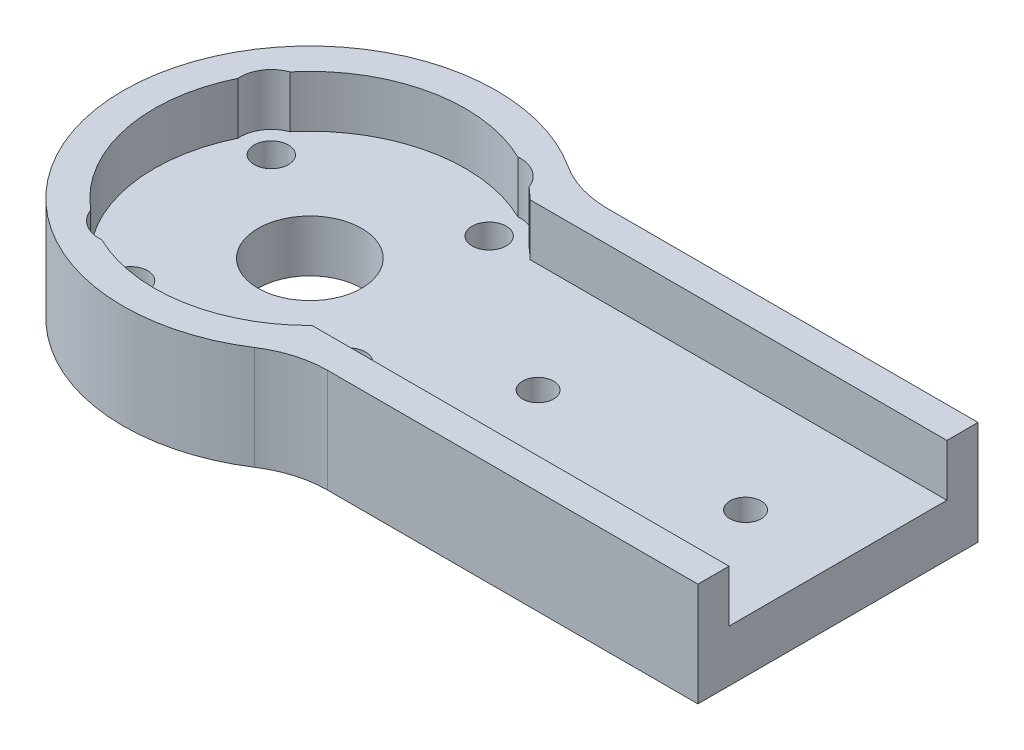
ISO-10303-21;
HEADER;
FILE_DESCRIPTION(('STEP AP214'),'2;1');
FILE_NAME('part.step','',(''),(''),'','','');
FILE_SCHEMA(('AUTOMOTIVE_DESIGN { 1 0 10303 214 1 1 1 1 }'));
ENDSEC;
DATA;
#1=APPLICATION_CONTEXT('core data for automotive mechanical design processes');
#2=APPLICATION_PROTOCOL_DEFINITION('international standard','automotive_design',2000,#1);
#3=PRODUCT_CONTEXT('',#1,'mechanical');
#4=PRODUCT('Part','Part','',(#3));
#5=PRODUCT_RELATED_PRODUCT_CATEGORY('part','',(#4));
#6=PRODUCT_DEFINITION_FORMATION('','',#4);
#7=PRODUCT_DEFINITION_CONTEXT('part definition',#1,'design');
#8=PRODUCT_DEFINITION('design','',#6,#7);
#9=PRODUCT_DEFINITION_SHAPE('','',#8);
#10=(LENGTH_UNIT() NAMED_UNIT(*) SI_UNIT(.MILLI.,.METRE.));
#11=(NAMED_UNIT(*) PLANE_ANGLE_UNIT() SI_UNIT($,.RADIAN.));
#12=(NAMED_UNIT(*) SI_UNIT($,.STERADIAN.) SOLID_ANGLE_UNIT());
#13=UNCERTAINTY_MEASURE_WITH_UNIT(LENGTH_MEASURE(1.E-05),#10,'distance_accuracy_value','');
#14=(GEOMETRIC_REPRESENTATION_CONTEXT(3) GLOBAL_UNCERTAINTY_ASSIGNED_CONTEXT((#13)) GLOBAL_UNIT_ASSIGNED_CONTEXT((#10,
#11,#12)) REPRESENTATION_CONTEXT('',''));
#15=CARTESIAN_POINT('',(0.,0.,0.));
#16=DIRECTION('',(0.,0.,1.));
#17=DIRECTION('',(1.,0.,0.));
#18=AXIS2_PLACEMENT_3D('',#15,#16,#17);
#19=CARTESIAN_POINT('',(0.,10.,0.));
#20=DIRECTION('',(0.,-1.,0.));
#21=DIRECTION('',(0.,0.,-1.));
#22=AXIS2_PLACEMENT_3D('',#19,#20,#21);
#23=CYLINDRICAL_SURFACE('',#22,15.);
#24=DIRECTION('',(0.,-1.,0.));
#25=VECTOR('',#24,1.);
#26=CARTESIAN_POINT('',(9.60224713630468,7.5,-11.5237515563869));
#27=LINE('',#26,#25);
#28=CARTESIAN_POINT('',(9.60224713630468,5.,-11.5237515563869));
#29=VERTEX_POINT('',#28);
#30=CARTESIAN_POINT('',(9.60224713630468,10.,-11.5237515563869));
#31=VERTEX_POINT('',#30);
#32=EDGE_CURVE('E195',#29,#31,#27,.F.);
#33=ORIENTED_EDGE('',*,*,#32,.F.);
#34=CARTESIAN_POINT('',(0.,5.,0.));
#35=DIRECTION('',(0.,-1.,0.));
#36=DIRECTION('',(0.,0.,1.));
#37=AXIS2_PLACEMENT_3D('',#34,#35,#36);
#38=CIRCLE('',#37,15.);
#39=CARTESIAN_POINT('',(10.7121426428143,5.,-10.5));
#40=VERTEX_POINT('',#39);
#41=EDGE_CURVE('E340',#29,#40,#38,.T.);
#42=ORIENTED_EDGE('',*,*,#41,.T.);
#43=DIRECTION('',(0.,-1.,0.));
#44=VECTOR('',#43,1.);
#45=CARTESIAN_POINT('',(10.7121426428143,10.,-10.5));
#46=LINE('',#45,#44);
#47=CARTESIAN_POINT('',(10.7121426428143,10.,-10.5));
#48=VERTEX_POINT('',#47);
#49=EDGE_CURVE('E239',#48,#40,#46,.T.);
#50=ORIENTED_EDGE('',*,*,#49,.F.);
#51=CARTESIAN_POINT('',(0.,10.,0.));
#52=DIRECTION('',(0.,-1.,0.));
#53=DIRECTION('',(0.,0.,1.));
#54=AXIS2_PLACEMENT_3D('',#51,#52,#53);
#55=CIRCLE('',#54,15.);
#56=EDGE_CURVE('E173',#31,#48,#55,.T.);
#57=ORIENTED_EDGE('',*,*,#56,.F.);
#58=EDGE_LOOP('',(#33,#42,#50,#57));
#59=FACE_BOUND('',#58,.T.);
#60=ADVANCED_FACE('F33',(#59),#23,.F.);
#61=DIRECTION('',(0.,-1.,0.));
#62=VECTOR('',#61,1.);
#63=CARTESIAN_POINT('',(6.55597581549295,7.5,-13.4914484436131));
#64=LINE('',#63,#62);
#65=CARTESIAN_POINT('',(6.55597581549295,10.,-13.4914484436131));
#66=VERTEX_POINT('',#65);
#67=CARTESIAN_POINT('',(6.55597581549295,5.,-13.4914484436131));
#68=VERTEX_POINT('',#67);
#69=EDGE_CURVE('E191',#66,#68,#64,.T.);
#70=ORIENTED_EDGE('',*,*,#69,.F.);
#71=CARTESIAN_POINT('',(-11.5237515563875,10.,-9.6022471363039));
#72=VERTEX_POINT('',#71);
#73=EDGE_CURVE('E174',#72,#66,#55,.T.);
#74=ORIENTED_EDGE('',*,*,#73,.F.);
#75=DIRECTION('',(0.,-1.,0.));
#76=VECTOR('',#75,1.);
#77=CARTESIAN_POINT('',(-11.5237515563875,7.5,-9.60224713630391));
#78=LINE('',#77,#76);
#79=CARTESIAN_POINT('',(-11.5237515563875,5.,-9.60224713630391));
#80=VERTEX_POINT('',#79);
#81=EDGE_CURVE('E189',#80,#72,#78,.F.);
#82=ORIENTED_EDGE('',*,*,#81,.F.);
#83=EDGE_CURVE('E192',#80,#68,#38,.T.);
#84=ORIENTED_EDGE('',*,*,#83,.T.);
#85=EDGE_LOOP('',(#70,#74,#82,#84));
#86=FACE_BOUND('',#85,.T.);
#87=ADVANCED_FACE('F187',(#86),#23,.F.);
#88=DIRECTION('',(0.,-1.,0.));
#89=VECTOR('',#88,1.);
#90=CARTESIAN_POINT('',(-9.60224713630402,7.5,11.5237515563874));
#91=LINE('',#90,#89);
#92=CARTESIAN_POINT('',(-9.60224713630402,5.,11.5237515563874));
#93=VERTEX_POINT('',#92);
#94=CARTESIAN_POINT('',(-9.60224713630403,10.,11.5237515563874));
#95=VERTEX_POINT('',#94);
#96=EDGE_CURVE('E150',#93,#95,#91,.F.);
#97=ORIENTED_EDGE('',*,*,#96,.F.);
#98=CARTESIAN_POINT('',(-13.4914484436131,5.,-6.55597581549307));
#99=VERTEX_POINT('',#98);
#100=EDGE_CURVE('E339',#93,#99,#38,.T.);
#101=ORIENTED_EDGE('',*,*,#100,.T.);
#102=DIRECTION('',(0.,-1.,0.));
#103=VECTOR('',#102,1.);
#104=CARTESIAN_POINT('',(-13.4914484436131,7.5,-6.55597581549309));
#105=LINE('',#104,#103);
#106=CARTESIAN_POINT('',(-13.4914484436131,10.,-6.55597581549309));
#107=VERTEX_POINT('',#106);
#108=EDGE_CURVE('E202',#107,#99,#105,.T.);
#109=ORIENTED_EDGE('',*,*,#108,.F.);
#110=EDGE_CURVE('E171',#95,#107,#55,.T.);
#111=ORIENTED_EDGE('',*,*,#110,.F.);
#112=EDGE_LOOP('',(#97,#101,#109,#111));
#113=FACE_BOUND('',#112,.T.);
#114=ADVANCED_FACE('F347',(#113),#23,.F.);
#115=DIRECTION('',(0.,-1.,0.));
#116=VECTOR('',#115,1.);
#117=CARTESIAN_POINT('',(-6.55597581549216,7.5,13.4914484436135));
#118=LINE('',#117,#116);
#119=CARTESIAN_POINT('',(-6.55597581549216,10.,13.4914484436135));
#120=VERTEX_POINT('',#119);
#121=CARTESIAN_POINT('',(-6.55597581549216,5.,13.4914484436135));
#122=VERTEX_POINT('',#121);
#123=EDGE_CURVE('E147',#120,#122,#118,.T.);
#124=ORIENTED_EDGE('',*,*,#123,.F.);
#125=CARTESIAN_POINT('',(10.7121426428143,10.,10.5));
#126=VERTEX_POINT('',#125);
#127=EDGE_CURVE('E161',#126,#120,#55,.T.);
#128=ORIENTED_EDGE('',*,*,#127,.F.);
#129=DIRECTION('',(0.,-1.,0.));
#130=VECTOR('',#129,1.);
#131=CARTESIAN_POINT('',(10.7121426428143,10.,10.5));
#132=LINE('',#131,#130);
#133=CARTESIAN_POINT('',(10.7121426428143,5.,10.5));
#134=VERTEX_POINT('',#133);
#135=EDGE_CURVE('E236',#126,#134,#132,.T.);
#136=ORIENTED_EDGE('',*,*,#135,.T.);
#137=EDGE_CURVE('E162',#134,#122,#38,.T.);
#138=ORIENTED_EDGE('',*,*,#137,.T.);
#139=EDGE_LOOP('',(#124,#128,#136,#138));
#140=FACE_BOUND('',#139,.T.);
#141=ADVANCED_FACE('F159',(#140),#23,.F.);
#142=CARTESIAN_POINT('',(50.9058808997907,5.,-13.5));
#143=DIRECTION('',(-1.,0.,0.));
#144=DIRECTION('',(0.,0.,1.));
#145=AXIS2_PLACEMENT_3D('',#142,#143,#144);
#146=PLANE('',#145);
#147=DIRECTION('',(0.,0.,-1.));
#148=VECTOR('',#147,1.);
#149=CARTESIAN_POINT('',(50.9058808997907,0.,-13.5));
#150=LINE('',#149,#148);
#151=CARTESIAN_POINT('',(50.9058808997907,0.,13.5));
#152=VERTEX_POINT('',#151);
#153=CARTESIAN_POINT('',(50.9058808997907,0.,-13.5));
#154=VERTEX_POINT('',#153);
#155=EDGE_CURVE('E284',#152,#154,#150,.T.);
#156=ORIENTED_EDGE('',*,*,#155,.T.);
#157=DIRECTION('',(0.,-1.,0.));
#158=VECTOR('',#157,1.);
#159=CARTESIAN_POINT('',(50.9058808997907,5.,-13.5));
#160=LINE('',#159,#158);
#161=CARTESIAN_POINT('',(50.9058808997907,10.,-13.5));
#162=VERTEX_POINT('',#161);
#163=EDGE_CURVE('E154',#162,#154,#160,.T.);
#164=ORIENTED_EDGE('',*,*,#163,.F.);
#165=DIRECTION('',(0.,0.,-1.));
#166=VECTOR('',#165,1.);
#167=CARTESIAN_POINT('',(50.9058808997907,10.,-13.5));
#168=LINE('',#167,#166);
#169=CARTESIAN_POINT('',(50.9058808997907,10.,-10.5));
#170=VERTEX_POINT('',#169);
#171=EDGE_CURVE('E209',#170,#162,#168,.T.);
#172=ORIENTED_EDGE('',*,*,#171,.F.);
#173=DIRECTION('',(0.,-1.,0.));
#174=VECTOR('',#173,1.);
#175=CARTESIAN_POINT('',(50.9058808997907,10.,-10.5));
#176=LINE('',#175,#174);
#177=CARTESIAN_POINT('',(50.9058808997907,5.,-10.5));
#178=VERTEX_POINT('',#177);
#179=EDGE_CURVE('E175',#170,#178,#176,.T.);
#180=ORIENTED_EDGE('',*,*,#179,.T.);
#181=DIRECTION('',(0.,0.,-1.));
#182=VECTOR('',#181,1.);
#183=CARTESIAN_POINT('',(50.9058808997907,5.,-13.5));
#184=LINE('',#183,#182);
#185=CARTESIAN_POINT('',(50.9058808997907,5.,10.5));
#186=VERTEX_POINT('',#185);
#187=EDGE_CURVE('E232',#186,#178,#184,.T.);
#188=ORIENTED_EDGE('',*,*,#187,.F.);
#189=DIRECTION('',(0.,-1.,0.));
#190=VECTOR('',#189,1.);
#191=CARTESIAN_POINT('',(50.9058808997907,10.,10.5));
#192=LINE('',#191,#190);
#193=CARTESIAN_POINT('',(50.9058808997907,10.,10.5));
#194=VERTEX_POINT('',#193);
#195=EDGE_CURVE('E228',#194,#186,#192,.T.);
#196=ORIENTED_EDGE('',*,*,#195,.F.);
#197=DIRECTION('',(0.,0.,-1.));
#198=VECTOR('',#197,1.);
#199=CARTESIAN_POINT('',(50.9058808997907,10.,13.5));
#200=LINE('',#199,#198);
#201=CARTESIAN_POINT('',(50.9058808997907,10.,13.5));
#202=VERTEX_POINT('',#201);
#203=EDGE_CURVE('E220',#202,#194,#200,.T.);
#204=ORIENTED_EDGE('',*,*,#203,.F.);
#205=DIRECTION('',(0.,-1.,0.));
#206=VECTOR('',#205,1.);
#207=CARTESIAN_POINT('',(50.9058808997907,5.,13.5));
#208=LINE('',#207,#206);
#209=EDGE_CURVE('E288',#202,#152,#208,.T.);
#210=ORIENTED_EDGE('',*,*,#209,.T.);
#211=EDGE_LOOP('',(#156,#164,#172,#180,#188,#196,#204,#210));
#212=FACE_BOUND('',#211,.T.);
#213=ADVANCED_FACE('F230',(#212),#146,.F.);
#214=CARTESIAN_POINT('',(11.9058808997907,5.,-13.5));
#215=DIRECTION('',(0.,0.,1.));
#216=DIRECTION('',(1.,0.,0.));
#217=AXIS2_PLACEMENT_3D('',#214,#215,#216);
#218=PLANE('',#217);
#219=DIRECTION('',(-1.,0.,0.));
#220=VECTOR('',#219,1.);
#221=CARTESIAN_POINT('',(11.9058808997907,0.,-13.5));
#222=LINE('',#221,#220);
#223=CARTESIAN_POINT('',(15.2233373476383,0.,-13.5));
#224=VERTEX_POINT('',#223);
#225=EDGE_CURVE('E291',#154,#224,#222,.T.);
#226=ORIENTED_EDGE('',*,*,#225,.T.);
#227=DIRECTION('',(0.,1.,0.));
#228=VECTOR('',#227,1.);
#229=CARTESIAN_POINT('',(15.2233373476383,10.,-13.5));
#230=LINE('',#229,#228);
#231=CARTESIAN_POINT('',(15.2233373476383,10.,-13.5));
#232=VERTEX_POINT('',#231);
#233=EDGE_CURVE('E305',#224,#232,#230,.T.);
#234=ORIENTED_EDGE('',*,*,#233,.T.);
#235=DIRECTION('',(-1.,0.,0.));
#236=VECTOR('',#235,1.);
#237=CARTESIAN_POINT('',(50.9058808997907,10.,-13.5));
#238=LINE('',#237,#236);
#239=EDGE_CURVE('E212',#162,#232,#238,.T.);
#240=ORIENTED_EDGE('',*,*,#239,.F.);
#241=ORIENTED_EDGE('',*,*,#163,.T.);
#242=EDGE_LOOP('',(#226,#234,#240,#241));
#243=FACE_BOUND('',#242,.T.);
#244=ADVANCED_FACE('F326',(#243),#218,.F.);
#245=CARTESIAN_POINT('',(0.,5.,0.));
#246=DIRECTION('',(0.,-1.,0.));
#247=DIRECTION('',(0.,0.,-1.));
#248=AXIS2_PLACEMENT_3D('',#245,#246,#247);
#249=CYLINDRICAL_SURFACE('',#248,18.);
#250=CARTESIAN_POINT('',(0.,10.,0.));
#251=DIRECTION('',(0.,1.,0.));
#252=DIRECTION('',(0.,0.,1.));
#253=AXIS2_PLACEMENT_3D('',#250,#251,#252);
#254=CIRCLE('',#253,18.);
#255=CARTESIAN_POINT('',(9.78643115205321,10.,-15.1071428571429));
#256=VERTEX_POINT('',#255);
#257=CARTESIAN_POINT('',(9.78643115205321,10.,15.1071428571429));
#258=VERTEX_POINT('',#257);
#259=EDGE_CURVE('E216',#256,#258,#254,.T.);
#260=ORIENTED_EDGE('',*,*,#259,.F.);
#261=DIRECTION('',(0.,-1.,0.));
#262=VECTOR('',#261,1.);
#263=CARTESIAN_POINT('',(9.78643115205321,5.,-15.1071428571429));
#264=LINE('',#263,#262);
#265=CARTESIAN_POINT('',(9.78643115205321,0.,-15.1071428571429));
#266=VERTEX_POINT('',#265);
#267=EDGE_CURVE('E302',#256,#266,#264,.T.);
#268=ORIENTED_EDGE('',*,*,#267,.T.);
#269=CARTESIAN_POINT('',(0.,0.,0.));
#270=DIRECTION('',(0.,1.,0.));
#271=DIRECTION('',(0.,0.,1.));
#272=AXIS2_PLACEMENT_3D('',#269,#270,#271);
#273=CIRCLE('',#272,18.);
#274=CARTESIAN_POINT('',(9.78643115205321,0.,15.1071428571429));
#275=VERTEX_POINT('',#274);
#276=EDGE_CURVE('E294',#266,#275,#273,.T.);
#277=ORIENTED_EDGE('',*,*,#276,.T.);
#278=DIRECTION('',(0.,-1.,0.));
#279=VECTOR('',#278,1.);
#280=CARTESIAN_POINT('',(9.78643115205321,5.,15.1071428571429));
#281=LINE('',#280,#279);
#282=EDGE_CURVE('E153',#275,#258,#281,.F.);
#283=ORIENTED_EDGE('',*,*,#282,.T.);
#284=EDGE_LOOP('',(#260,#268,#277,#283));
#285=FACE_BOUND('',#284,.T.);
#286=ADVANCED_FACE('F319',(#285),#249,.T.);
#287=CARTESIAN_POINT('',(11.9058808997907,5.,13.5));
#288=DIRECTION('',(0.,0.,-1.));
#289=DIRECTION('',(-1.,0.,0.));
#290=AXIS2_PLACEMENT_3D('',#287,#288,#289);
#291=PLANE('',#290);
#292=DIRECTION('',(1.,0.,0.));
#293=VECTOR('',#292,1.);
#294=CARTESIAN_POINT('',(50.9058808997907,10.,13.5));
#295=LINE('',#294,#293);
#296=CARTESIAN_POINT('',(15.2233373476383,10.,13.5));
#297=VERTEX_POINT('',#296);
#298=EDGE_CURVE('E218',#297,#202,#295,.T.);
#299=ORIENTED_EDGE('',*,*,#298,.F.);
#300=DIRECTION('',(0.,1.,0.));
#301=VECTOR('',#300,1.);
#302=CARTESIAN_POINT('',(15.2233373476383,0.,13.5));
#303=LINE('',#302,#301);
#304=CARTESIAN_POINT('',(15.2233373476383,0.,13.5));
#305=VERTEX_POINT('',#304);
#306=EDGE_CURVE('E307',#297,#305,#303,.F.);
#307=ORIENTED_EDGE('',*,*,#306,.T.);
#308=DIRECTION('',(1.,0.,0.));
#309=VECTOR('',#308,1.);
#310=CARTESIAN_POINT('',(11.9058808997907,0.,13.5));
#311=LINE('',#310,#309);
#312=EDGE_CURVE('E289',#305,#152,#311,.T.);
#313=ORIENTED_EDGE('',*,*,#312,.T.);
#314=ORIENTED_EDGE('',*,*,#209,.F.);
#315=EDGE_LOOP('',(#299,#307,#313,#314));
#316=FACE_BOUND('',#315,.T.);
#317=ADVANCED_FACE('F322',(#316),#291,.F.);
#318=CARTESIAN_POINT('',(0.,5.,0.));
#319=DIRECTION('',(0.,1.,0.));
#320=DIRECTION('',(0.,0.,1.));
#321=AXIS2_PLACEMENT_3D('',#318,#319,#320);
#322=PLANE('',#321);
#323=ORIENTED_EDGE('',*,*,#41,.F.);
#324=CARTESIAN_POINT('',(6.78232998312527,5.,-10.5));
#325=DIRECTION('',(0.,1.,0.));
#326=DIRECTION('',(0.,0.,1.));
#327=AXIS2_PLACEMENT_3D('',#324,#325,#326);
#328=CIRCLE('',#327,3.);
#329=EDGE_CURVE('E353',#29,#68,#328,.T.);
#330=ORIENTED_EDGE('',*,*,#329,.T.);
#331=ORIENTED_EDGE('',*,*,#83,.F.);
#332=CARTESIAN_POINT('',(-10.4999999999999,5.,-6.78232998312477));
#333=DIRECTION('',(0.,1.,0.));
#334=DIRECTION('',(0.,0.,1.));
#335=AXIS2_PLACEMENT_3D('',#332,#333,#334);
#336=CIRCLE('',#335,3.);
#337=EDGE_CURVE('E197',#80,#99,#336,.T.);
#338=ORIENTED_EDGE('',*,*,#337,.T.);
#339=ORIENTED_EDGE('',*,*,#100,.F.);
#340=CARTESIAN_POINT('',(-6.78232998312466,5.,10.5000000000004));
#341=DIRECTION('',(0.,1.,0.));
#342=DIRECTION('',(0.,0.,1.));
#343=AXIS2_PLACEMENT_3D('',#340,#341,#342);
#344=CIRCLE('',#343,3.);
#345=EDGE_CURVE('E354',#93,#122,#344,.T.);
#346=ORIENTED_EDGE('',*,*,#345,.T.);
#347=ORIENTED_EDGE('',*,*,#137,.F.);
#348=DIRECTION('',(-1.,0.,0.));
#349=VECTOR('',#348,1.);
#350=CARTESIAN_POINT('',(50.9058808997907,5.,10.5));
#351=LINE('',#350,#349);
#352=EDGE_CURVE('E208',#186,#134,#351,.T.);
#353=ORIENTED_EDGE('',*,*,#352,.F.);
#354=ORIENTED_EDGE('',*,*,#187,.T.);
#355=DIRECTION('',(1.,0.,0.));
#356=VECTOR('',#355,1.);
#357=CARTESIAN_POINT('',(50.9058808997907,5.,-10.5));
#358=LINE('',#357,#356);
#359=EDGE_CURVE('E213',#40,#178,#358,.T.);
#360=ORIENTED_EDGE('',*,*,#359,.F.);
#361=EDGE_LOOP('',(#323,#330,#331,#338,#339,#346,#347,#353,#354,#360));
#362=FACE_BOUND('',#361,.T.);
#363=CARTESIAN_POINT('',(42.,5.,0.));
#364=DIRECTION('',(0.,1.,0.));
#365=DIRECTION('',(0.,0.,1.));
#366=AXIS2_PLACEMENT_3D('',#363,#364,#365);
#367=CIRCLE('',#366,1.5);
#368=CARTESIAN_POINT('',(42.,5.,1.5));
#369=VERTEX_POINT('',#368);
#370=EDGE_CURVE('E235',#369,#369,#367,.T.);
#371=ORIENTED_EDGE('',*,*,#370,.F.);
#372=EDGE_LOOP('',(#371));
#373=FACE_BOUND('',#372,.T.);
#374=CARTESIAN_POINT('',(22.,5.,0.));
#375=DIRECTION('',(0.,1.,0.));
#376=DIRECTION('',(0.,0.,1.));
#377=AXIS2_PLACEMENT_3D('',#374,#375,#376);
#378=CIRCLE('',#377,1.5);
#379=CARTESIAN_POINT('',(22.,5.,1.5));
#380=VERTEX_POINT('',#379);
#381=EDGE_CURVE('E248',#380,#380,#378,.T.);
#382=ORIENTED_EDGE('',*,*,#381,.F.);
#383=EDGE_LOOP('',(#382));
#384=FACE_BOUND('',#383,.T.);
#385=CARTESIAN_POINT('',(10.5000000000005,5.,6.78232998312516));
#386=DIRECTION('',(0.,1.,0.));
#387=DIRECTION('',(0.,0.,1.));
#388=AXIS2_PLACEMENT_3D('',#385,#386,#387);
#389=CIRCLE('',#388,1.64999999999998);
#390=CARTESIAN_POINT('',(10.5000000000005,5.,8.43232998312515));
#391=VERTEX_POINT('',#390);
#392=EDGE_CURVE('E261',#391,#391,#389,.T.);
#393=ORIENTED_EDGE('',*,*,#392,.F.);
#394=EDGE_LOOP('',(#393));
#395=FACE_BOUND('',#394,.T.);
#396=CARTESIAN_POINT('',(0.,5.,0.));
#397=DIRECTION('',(0.,1.,0.));
#398=DIRECTION('',(0.,0.,1.));
#399=AXIS2_PLACEMENT_3D('',#396,#397,#398);
#400=CIRCLE('',#399,5.);
#401=CARTESIAN_POINT('',(0.,5.,5.));
#402=VERTEX_POINT('',#401);
#403=EDGE_CURVE('E278',#402,#402,#400,.T.);
#404=ORIENTED_EDGE('',*,*,#403,.F.);
#405=EDGE_LOOP('',(#404));
#406=FACE_BOUND('',#405,.T.);
#407=CARTESIAN_POINT('',(-10.4999999999999,5.,-6.78232998312477));
#408=DIRECTION('',(0.,1.,0.));
#409=DIRECTION('',(0.,0.,1.));
#410=AXIS2_PLACEMENT_3D('',#407,#408,#409);
#411=CIRCLE('',#410,1.65000000000059);
#412=CARTESIAN_POINT('',(-10.4999999999999,5.,-5.13232998312417));
#413=VERTEX_POINT('',#412);
#414=EDGE_CURVE('E254',#413,#413,#411,.T.);
#415=ORIENTED_EDGE('',*,*,#414,.F.);
#416=EDGE_LOOP('',(#415));
#417=FACE_BOUND('',#416,.T.);
#418=CARTESIAN_POINT('',(-6.78232998312466,5.,10.5000000000004));
#419=DIRECTION('',(0.,1.,0.));
#420=DIRECTION('',(0.,0.,1.));
#421=AXIS2_PLACEMENT_3D('',#418,#419,#420);
#422=CIRCLE('',#421,1.65000000000052);
#423=CARTESIAN_POINT('',(-6.78232998312466,5.,12.1500000000009));
#424=VERTEX_POINT('',#423);
#425=EDGE_CURVE('E267',#424,#424,#422,.T.);
#426=ORIENTED_EDGE('',*,*,#425,.F.);
#427=EDGE_LOOP('',(#426));
#428=FACE_BOUND('',#427,.T.);
#429=CARTESIAN_POINT('',(6.78232998312527,5.,-10.5));
#430=DIRECTION('',(0.,1.,0.));
#431=DIRECTION('',(0.,0.,1.));
#432=AXIS2_PLACEMENT_3D('',#429,#430,#431);
#433=CIRCLE('',#432,1.65);
#434=CARTESIAN_POINT('',(6.78232998312527,5.,-8.85));
#435=VERTEX_POINT('',#434);
#436=EDGE_CURVE('E260',#435,#435,#433,.T.);
#437=ORIENTED_EDGE('',*,*,#436,.F.);
#438=EDGE_LOOP('',(#437));
#439=FACE_BOUND('',#438,.T.);
#440=ADVANCED_FACE('F351',(#362,#373,#384,#395,#406,#417,#428,#439),#322,.T.);
#441=CARTESIAN_POINT('',(0.,0.,0.));
#442=DIRECTION('',(0.,1.,0.));
#443=DIRECTION('',(0.,0.,1.));
#444=AXIS2_PLACEMENT_3D('',#441,#442,#443);
#445=PLANE('',#444);
#446=CARTESIAN_POINT('',(42.,0.,0.));
#447=DIRECTION('',(0.,1.,0.));
#448=DIRECTION('',(0.,0.,1.));
#449=AXIS2_PLACEMENT_3D('',#446,#447,#448);
#450=CIRCLE('',#449,1.5);
#451=CARTESIAN_POINT('',(42.,0.,1.5));
#452=VERTEX_POINT('',#451);
#453=EDGE_CURVE('E245',#452,#452,#450,.T.);
#454=ORIENTED_EDGE('',*,*,#453,.T.);
#455=EDGE_LOOP('',(#454));
#456=FACE_BOUND('',#455,.T.);
#457=CARTESIAN_POINT('',(22.,0.,0.));
#458=DIRECTION('',(0.,1.,0.));
#459=DIRECTION('',(0.,0.,1.));
#460=AXIS2_PLACEMENT_3D('',#457,#458,#459);
#461=CIRCLE('',#460,1.5);
#462=CARTESIAN_POINT('',(22.,0.,1.5));
#463=VERTEX_POINT('',#462);
#464=EDGE_CURVE('E251',#463,#463,#461,.T.);
#465=ORIENTED_EDGE('',*,*,#464,.T.);
#466=EDGE_LOOP('',(#465));
#467=FACE_BOUND('',#466,.T.);
#468=CARTESIAN_POINT('',(10.5000000000005,0.,6.78232998312516));
#469=DIRECTION('',(0.,1.,0.));
#470=DIRECTION('',(0.,0.,1.));
#471=AXIS2_PLACEMENT_3D('',#468,#469,#470);
#472=CIRCLE('',#471,1.64999999999998);
#473=CARTESIAN_POINT('',(10.5000000000005,0.,8.43232998312515));
#474=VERTEX_POINT('',#473);
#475=EDGE_CURVE('E257',#474,#474,#472,.T.);
#476=ORIENTED_EDGE('',*,*,#475,.T.);
#477=EDGE_LOOP('',(#476));
#478=FACE_BOUND('',#477,.T.);
#479=CARTESIAN_POINT('',(-6.78232998312466,0.,10.5000000000004));
#480=DIRECTION('',(0.,1.,0.));
#481=DIRECTION('',(0.,0.,1.));
#482=AXIS2_PLACEMENT_3D('',#479,#480,#481);
#483=CIRCLE('',#482,1.65000000000052);
#484=CARTESIAN_POINT('',(-6.78232998312466,0.,12.1500000000009));
#485=VERTEX_POINT('',#484);
#486=EDGE_CURVE('E264',#485,#485,#483,.T.);
#487=ORIENTED_EDGE('',*,*,#486,.T.);
#488=EDGE_LOOP('',(#487));
#489=FACE_BOUND('',#488,.T.);
#490=CARTESIAN_POINT('',(-10.4999999999999,0.,-6.78232998312477));
#491=DIRECTION('',(0.,1.,0.));
#492=DIRECTION('',(0.,0.,1.));
#493=AXIS2_PLACEMENT_3D('',#490,#491,#492);
#494=CIRCLE('',#493,1.65000000000059);
#495=CARTESIAN_POINT('',(-10.4999999999999,0.,-5.13232998312417));
#496=VERTEX_POINT('',#495);
#497=EDGE_CURVE('E270',#496,#496,#494,.T.);
#498=ORIENTED_EDGE('',*,*,#497,.T.);
#499=EDGE_LOOP('',(#498));
#500=FACE_BOUND('',#499,.T.);
#501=CARTESIAN_POINT('',(6.78232998312527,0.,-10.5));
#502=DIRECTION('',(0.,1.,0.));
#503=DIRECTION('',(0.,0.,1.));
#504=AXIS2_PLACEMENT_3D('',#501,#502,#503);
#505=CIRCLE('',#504,1.65);
#506=CARTESIAN_POINT('',(6.78232998312527,0.,-8.85));
#507=VERTEX_POINT('',#506);
#508=EDGE_CURVE('E275',#507,#507,#505,.T.);
#509=ORIENTED_EDGE('',*,*,#508,.T.);
#510=EDGE_LOOP('',(#509));
#511=FACE_BOUND('',#510,.T.);
#512=CARTESIAN_POINT('',(0.,0.,0.));
#513=DIRECTION('',(0.,1.,0.));
#514=DIRECTION('',(0.,0.,1.));
#515=AXIS2_PLACEMENT_3D('',#512,#513,#514);
#516=CIRCLE('',#515,5.);
#517=CARTESIAN_POINT('',(0.,0.,5.));
#518=VERTEX_POINT('',#517);
#519=EDGE_CURVE('E281',#518,#518,#516,.T.);
#520=ORIENTED_EDGE('',*,*,#519,.T.);
#521=EDGE_LOOP('',(#520));
#522=FACE_BOUND('',#521,.T.);
#523=ORIENTED_EDGE('',*,*,#155,.F.);
#524=ORIENTED_EDGE('',*,*,#312,.F.);
#525=CARTESIAN_POINT('',(15.2233373476383,0.,23.5));
#526=DIRECTION('',(0.,1.,0.));
#527=DIRECTION('',(0.,0.,1.));
#528=AXIS2_PLACEMENT_3D('',#525,#526,#527);
#529=CIRCLE('',#528,10.);
#530=EDGE_CURVE('E41',#305,#275,#529,.T.);
#531=ORIENTED_EDGE('',*,*,#530,.T.);
#532=ORIENTED_EDGE('',*,*,#276,.F.);
#533=CARTESIAN_POINT('',(15.2233373476383,0.,-23.5));
#534=DIRECTION('',(0.,1.,0.));
#535=DIRECTION('',(0.,0.,1.));
#536=AXIS2_PLACEMENT_3D('',#533,#534,#535);
#537=CIRCLE('',#536,10.);
#538=EDGE_CURVE('E309',#266,#224,#537,.T.);
#539=ORIENTED_EDGE('',*,*,#538,.T.);
#540=ORIENTED_EDGE('',*,*,#225,.F.);
#541=EDGE_LOOP('',(#523,#524,#531,#532,#539,#540));
#542=FACE_BOUND('',#541,.T.);
#543=ADVANCED_FACE('F316',(#456,#467,#478,#489,#500,#511,#522,#542),#445,.F.);
#544=CARTESIAN_POINT('',(0.,0.,0.));
#545=DIRECTION('',(0.,1.,0.));
#546=DIRECTION('',(0.,0.,1.));
#547=AXIS2_PLACEMENT_3D('',#544,#545,#546);
#548=CYLINDRICAL_SURFACE('',#547,5.);
#549=ORIENTED_EDGE('',*,*,#519,.F.);
#550=EDGE_LOOP('',(#549));
#551=FACE_BOUND('',#550,.T.);
#552=ORIENTED_EDGE('',*,*,#403,.T.);
#553=EDGE_LOOP('',(#552));
#554=FACE_BOUND('',#553,.T.);
#555=ADVANCED_FACE('F478',(#551,#554),#548,.F.);
#556=CARTESIAN_POINT('',(6.78232998312527,0.,-10.5));
#557=DIRECTION('',(0.,1.,0.));
#558=DIRECTION('',(0.,0.,1.));
#559=AXIS2_PLACEMENT_3D('',#556,#557,#558);
#560=CYLINDRICAL_SURFACE('',#559,1.65);
#561=ORIENTED_EDGE('',*,*,#508,.F.);
#562=EDGE_LOOP('',(#561));
#563=FACE_BOUND('',#562,.T.);
#564=ORIENTED_EDGE('',*,*,#436,.T.);
#565=EDGE_LOOP('',(#564));
#566=FACE_BOUND('',#565,.T.);
#567=ADVANCED_FACE('F468',(#563,#566),#560,.F.);
#568=CARTESIAN_POINT('',(-10.4999999999999,0.,-6.78232998312477));
#569=DIRECTION('',(0.,1.,0.));
#570=DIRECTION('',(0.,0.,1.));
#571=AXIS2_PLACEMENT_3D('',#568,#569,#570);
#572=CYLINDRICAL_SURFACE('',#571,1.65000000000059);
#573=ORIENTED_EDGE('',*,*,#497,.F.);
#574=EDGE_LOOP('',(#573));
#575=FACE_BOUND('',#574,.T.);
#576=ORIENTED_EDGE('',*,*,#414,.T.);
#577=EDGE_LOOP('',(#576));
#578=FACE_BOUND('',#577,.T.);
#579=ADVANCED_FACE('F458',(#575,#578),#572,.F.);
#580=CARTESIAN_POINT('',(-6.78232998312466,0.,10.5000000000004));
#581=DIRECTION('',(0.,1.,0.));
#582=DIRECTION('',(0.,0.,1.));
#583=AXIS2_PLACEMENT_3D('',#580,#581,#582);
#584=CYLINDRICAL_SURFACE('',#583,1.65000000000052);
#585=ORIENTED_EDGE('',*,*,#486,.F.);
#586=EDGE_LOOP('',(#585));
#587=FACE_BOUND('',#586,.T.);
#588=ORIENTED_EDGE('',*,*,#425,.T.);
#589=EDGE_LOOP('',(#588));
#590=FACE_BOUND('',#589,.T.);
#591=ADVANCED_FACE('F448',(#587,#590),#584,.F.);
#592=CARTESIAN_POINT('',(10.5000000000005,0.,6.78232998312516));
#593=DIRECTION('',(0.,1.,0.));
#594=DIRECTION('',(0.,0.,1.));
#595=AXIS2_PLACEMENT_3D('',#592,#593,#594);
#596=CYLINDRICAL_SURFACE('',#595,1.64999999999998);
#597=ORIENTED_EDGE('',*,*,#475,.F.);
#598=EDGE_LOOP('',(#597));
#599=FACE_BOUND('',#598,.T.);
#600=ORIENTED_EDGE('',*,*,#392,.T.);
#601=EDGE_LOOP('',(#600));
#602=FACE_BOUND('',#601,.T.);
#603=ADVANCED_FACE('F438',(#599,#602),#596,.F.);
#604=CARTESIAN_POINT('',(22.,0.,0.));
#605=DIRECTION('',(0.,1.,0.));
#606=DIRECTION('',(0.,0.,1.));
#607=AXIS2_PLACEMENT_3D('',#604,#605,#606);
#608=CYLINDRICAL_SURFACE('',#607,1.5);
#609=ORIENTED_EDGE('',*,*,#464,.F.);
#610=EDGE_LOOP('',(#609));
#611=FACE_BOUND('',#610,.T.);
#612=ORIENTED_EDGE('',*,*,#381,.T.);
#613=EDGE_LOOP('',(#612));
#614=FACE_BOUND('',#613,.T.);
#615=ADVANCED_FACE('F428',(#611,#614),#608,.F.);
#616=CARTESIAN_POINT('',(42.,0.,0.));
#617=DIRECTION('',(0.,1.,0.));
#618=DIRECTION('',(0.,0.,1.));
#619=AXIS2_PLACEMENT_3D('',#616,#617,#618);
#620=CYLINDRICAL_SURFACE('',#619,1.5);
#621=ORIENTED_EDGE('',*,*,#453,.F.);
#622=EDGE_LOOP('',(#621));
#623=FACE_BOUND('',#622,.T.);
#624=ORIENTED_EDGE('',*,*,#370,.T.);
#625=EDGE_LOOP('',(#624));
#626=FACE_BOUND('',#625,.T.);
#627=ADVANCED_FACE('F410',(#623,#626),#620,.F.);
#628=CARTESIAN_POINT('',(50.9058808997907,10.,10.5));
#629=DIRECTION('',(0.,0.,1.));
#630=DIRECTION('',(1.,0.,0.));
#631=AXIS2_PLACEMENT_3D('',#628,#629,#630);
#632=PLANE('',#631);
#633=ORIENTED_EDGE('',*,*,#352,.T.);
#634=ORIENTED_EDGE('',*,*,#135,.F.);
#635=DIRECTION('',(-1.,0.,0.));
#636=VECTOR('',#635,1.);
#637=CARTESIAN_POINT('',(50.9058808997907,10.,10.5));
#638=LINE('',#637,#636);
#639=EDGE_CURVE('E168',#194,#126,#638,.T.);
#640=ORIENTED_EDGE('',*,*,#639,.F.);
#641=ORIENTED_EDGE('',*,*,#195,.T.);
#642=EDGE_LOOP('',(#633,#634,#640,#641));
#643=FACE_BOUND('',#642,.T.);
#644=ADVANCED_FACE('F238',(#643),#632,.F.);
#645=CARTESIAN_POINT('',(50.9058808997907,10.,-10.5));
#646=DIRECTION('',(0.,0.,-1.));
#647=DIRECTION('',(-1.,0.,0.));
#648=AXIS2_PLACEMENT_3D('',#645,#646,#647);
#649=PLANE('',#648);
#650=ORIENTED_EDGE('',*,*,#359,.T.);
#651=ORIENTED_EDGE('',*,*,#179,.F.);
#652=DIRECTION('',(1.,0.,0.));
#653=VECTOR('',#652,1.);
#654=CARTESIAN_POINT('',(50.9058808997907,10.,-10.5));
#655=LINE('',#654,#653);
#656=EDGE_CURVE('E170',#48,#170,#655,.T.);
#657=ORIENTED_EDGE('',*,*,#656,.F.);
#658=ORIENTED_EDGE('',*,*,#49,.T.);
#659=EDGE_LOOP('',(#650,#651,#657,#658));
#660=FACE_BOUND('',#659,.T.);
#661=ADVANCED_FACE('F334',(#660),#649,.F.);
#662=CARTESIAN_POINT('',(0.,10.,0.));
#663=DIRECTION('',(0.,1.,0.));
#664=DIRECTION('',(0.,0.,1.));
#665=AXIS2_PLACEMENT_3D('',#662,#663,#664);
#666=PLANE('',#665);
#667=ORIENTED_EDGE('',*,*,#73,.T.);
#668=CARTESIAN_POINT('',(6.78232998312527,10.,-10.5));
#669=DIRECTION('',(0.,1.,0.));
#670=DIRECTION('',(0.,0.,1.));
#671=AXIS2_PLACEMENT_3D('',#668,#669,#670);
#672=CIRCLE('',#671,3.);
#673=EDGE_CURVE('E163',#31,#66,#672,.T.);
#674=ORIENTED_EDGE('',*,*,#673,.F.);
#675=ORIENTED_EDGE('',*,*,#56,.T.);
#676=ORIENTED_EDGE('',*,*,#656,.T.);
#677=ORIENTED_EDGE('',*,*,#171,.T.);
#678=ORIENTED_EDGE('',*,*,#239,.T.);
#679=CARTESIAN_POINT('',(15.2233373476383,10.,-23.5));
#680=DIRECTION('',(0.,1.,0.));
#681=DIRECTION('',(0.,0.,1.));
#682=AXIS2_PLACEMENT_3D('',#679,#680,#681);
#683=CIRCLE('',#682,10.);
#684=EDGE_CURVE('E311',#232,#256,#683,.F.);
#685=ORIENTED_EDGE('',*,*,#684,.T.);
#686=ORIENTED_EDGE('',*,*,#259,.T.);
#687=CARTESIAN_POINT('',(15.2233373476383,10.,23.5));
#688=DIRECTION('',(0.,1.,0.));
#689=DIRECTION('',(0.,0.,1.));
#690=AXIS2_PLACEMENT_3D('',#687,#688,#689);
#691=CIRCLE('',#690,10.);
#692=EDGE_CURVE('E11',#258,#297,#691,.F.);
#693=ORIENTED_EDGE('',*,*,#692,.T.);
#694=ORIENTED_EDGE('',*,*,#298,.T.);
#695=ORIENTED_EDGE('',*,*,#203,.T.);
#696=ORIENTED_EDGE('',*,*,#639,.T.);
#697=ORIENTED_EDGE('',*,*,#127,.T.);
#698=CARTESIAN_POINT('',(-6.78232998312466,10.,10.5000000000004));
#699=DIRECTION('',(0.,1.,0.));
#700=DIRECTION('',(0.,0.,1.));
#701=AXIS2_PLACEMENT_3D('',#698,#699,#700);
#702=CIRCLE('',#701,3.);
#703=EDGE_CURVE('E144',#120,#95,#702,.F.);
#704=ORIENTED_EDGE('',*,*,#703,.T.);
#705=ORIENTED_EDGE('',*,*,#110,.T.);
#706=CARTESIAN_POINT('',(-10.4999999999999,10.,-6.78232998312477));
#707=DIRECTION('',(0.,1.,0.));
#708=DIRECTION('',(0.,0.,1.));
#709=AXIS2_PLACEMENT_3D('',#706,#707,#708);
#710=CIRCLE('',#709,3.);
#711=EDGE_CURVE('E183',#72,#107,#710,.T.);
#712=ORIENTED_EDGE('',*,*,#711,.F.);
#713=EDGE_LOOP('',(#667,#674,#675,#676,#677,#678,#685,#686,#693,#694,#695,#696,#697,#704,#705,#712));
#714=FACE_BOUND('',#713,.T.);
#715=ADVANCED_FACE('F166',(#714),#666,.T.);
#716=CARTESIAN_POINT('',(-10.4999999999999,10.,-6.78232998312477));
#717=DIRECTION('',(0.,-1.,0.));
#718=DIRECTION('',(0.,0.,-1.));
#719=AXIS2_PLACEMENT_3D('',#716,#717,#718);
#720=CYLINDRICAL_SURFACE('',#719,3.);
#721=ORIENTED_EDGE('',*,*,#81,.T.);
#722=ORIENTED_EDGE('',*,*,#711,.T.);
#723=ORIENTED_EDGE('',*,*,#108,.T.);
#724=ORIENTED_EDGE('',*,*,#337,.F.);
#725=EDGE_LOOP('',(#721,#722,#723,#724));
#726=FACE_BOUND('',#725,.T.);
#727=ADVANCED_FACE('F350',(#726),#720,.F.);
#728=CARTESIAN_POINT('',(-6.78232998312466,10.,10.5000000000004));
#729=DIRECTION('',(0.,-1.,0.));
#730=DIRECTION('',(0.,0.,-1.));
#731=AXIS2_PLACEMENT_3D('',#728,#729,#730);
#732=CYLINDRICAL_SURFACE('',#731,3.);
#733=ORIENTED_EDGE('',*,*,#96,.T.);
#734=ORIENTED_EDGE('',*,*,#703,.F.);
#735=ORIENTED_EDGE('',*,*,#123,.T.);
#736=ORIENTED_EDGE('',*,*,#345,.F.);
#737=EDGE_LOOP('',(#733,#734,#735,#736));
#738=FACE_BOUND('',#737,.T.);
#739=ADVANCED_FACE('F146',(#738),#732,.F.);
#740=CARTESIAN_POINT('',(6.78232998312527,10.,-10.5));
#741=DIRECTION('',(0.,-1.,0.));
#742=DIRECTION('',(0.,0.,-1.));
#743=AXIS2_PLACEMENT_3D('',#740,#741,#742);
#744=CYLINDRICAL_SURFACE('',#743,3.);
#745=ORIENTED_EDGE('',*,*,#32,.T.);
#746=ORIENTED_EDGE('',*,*,#673,.T.);
#747=ORIENTED_EDGE('',*,*,#69,.T.);
#748=ORIENTED_EDGE('',*,*,#329,.F.);
#749=EDGE_LOOP('',(#745,#746,#747,#748));
#750=FACE_BOUND('',#749,.T.);
#751=ADVANCED_FACE('F358',(#750),#744,.F.);
#752=CARTESIAN_POINT('',(15.2233373476383,5.,-23.5));
#753=DIRECTION('',(0.,-1.,0.));
#754=DIRECTION('',(0.,0.,-1.));
#755=AXIS2_PLACEMENT_3D('',#752,#753,#754);
#756=CYLINDRICAL_SURFACE('',#755,10.);
#757=ORIENTED_EDGE('',*,*,#684,.F.);
#758=ORIENTED_EDGE('',*,*,#233,.F.);
#759=ORIENTED_EDGE('',*,*,#538,.F.);
#760=ORIENTED_EDGE('',*,*,#267,.F.);
#761=EDGE_LOOP('',(#757,#758,#759,#760));
#762=FACE_BOUND('',#761,.T.);
#763=ADVANCED_FACE('F360',(#762),#756,.F.);
#764=CARTESIAN_POINT('',(15.2233373476383,5.,23.5));
#765=DIRECTION('',(0.,-1.,0.));
#766=DIRECTION('',(0.,0.,-1.));
#767=AXIS2_PLACEMENT_3D('',#764,#765,#766);
#768=CYLINDRICAL_SURFACE('',#767,10.);
#769=ORIENTED_EDGE('',*,*,#692,.F.);
#770=ORIENTED_EDGE('',*,*,#282,.F.);
#771=ORIENTED_EDGE('',*,*,#530,.F.);
#772=ORIENTED_EDGE('',*,*,#306,.F.);
#773=EDGE_LOOP('',(#769,#770,#771,#772));
#774=FACE_BOUND('',#773,.T.);
#775=ADVANCED_FACE('F35',(#774),#768,.F.);
#776=CLOSED_SHELL('',(#60,#87,#114,#141,#213,#244,#286,#317,#440,#543,#555,#567,#579,#591,#603,
#615,#627,#644,#661,#715,#727,#739,#751,#763,#775));
#777=MANIFOLD_SOLID_BREP('B2',#776);
#778=ADVANCED_BREP_SHAPE_REPRESENTATION('',(#18,#777),#14);
#779=SHAPE_DEFINITION_REPRESENTATION(#9,#778);
ENDSEC;
END-ISO-10303-21;
